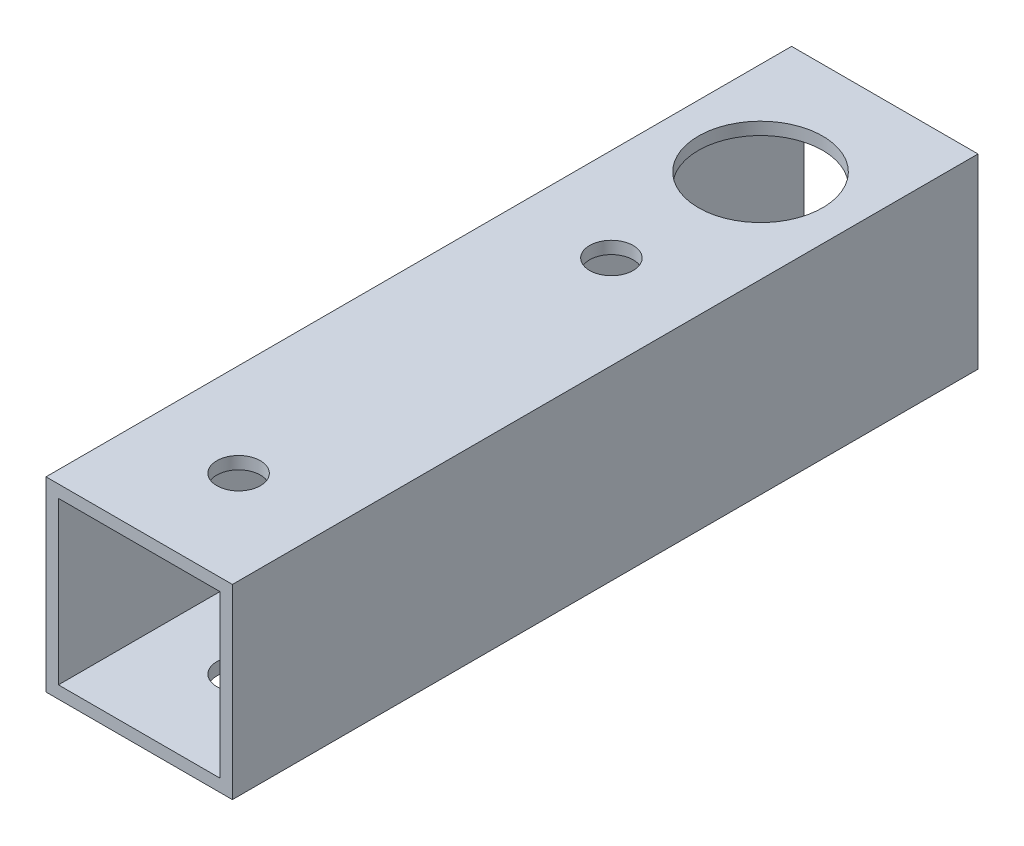
ISO-10303-21;
HEADER;
FILE_DESCRIPTION(('STEP AP214'),'2;1');
FILE_NAME('part.step','',(''),(''),'','','');
FILE_SCHEMA(('AUTOMOTIVE_DESIGN { 1 0 10303 214 1 1 1 1 }'));
ENDSEC;
DATA;
#1=APPLICATION_CONTEXT('core data for automotive mechanical design processes');
#2=APPLICATION_PROTOCOL_DEFINITION('international standard','automotive_design',2000,#1);
#3=PRODUCT_CONTEXT('',#1,'mechanical');
#4=PRODUCT('Part','Part','',(#3));
#5=PRODUCT_RELATED_PRODUCT_CATEGORY('part','',(#4));
#6=PRODUCT_DEFINITION_FORMATION('','',#4);
#7=PRODUCT_DEFINITION_CONTEXT('part definition',#1,'design');
#8=PRODUCT_DEFINITION('design','',#6,#7);
#9=PRODUCT_DEFINITION_SHAPE('','',#8);
#10=(LENGTH_UNIT() NAMED_UNIT(*) SI_UNIT(.MILLI.,.METRE.));
#11=(NAMED_UNIT(*) PLANE_ANGLE_UNIT() SI_UNIT($,.RADIAN.));
#12=(NAMED_UNIT(*) SI_UNIT($,.STERADIAN.) SOLID_ANGLE_UNIT());
#13=UNCERTAINTY_MEASURE_WITH_UNIT(LENGTH_MEASURE(1.E-05),#10,'distance_accuracy_value','');
#14=(GEOMETRIC_REPRESENTATION_CONTEXT(3) GLOBAL_UNCERTAINTY_ASSIGNED_CONTEXT((#13)) GLOBAL_UNIT_ASSIGNED_CONTEXT((#10,
#11,#12)) REPRESENTATION_CONTEXT('',''));
#15=CARTESIAN_POINT('',(0.,0.,0.));
#16=DIRECTION('',(0.,0.,1.));
#17=DIRECTION('',(1.,0.,0.));
#18=AXIS2_PLACEMENT_3D('',#15,#16,#17);
#19=CARTESIAN_POINT('',(-7.5,-7.50000000000001,30.));
#20=DIRECTION('',(0.,0.,1.));
#21=DIRECTION('',(1.,0.,0.));
#22=AXIS2_PLACEMENT_3D('',#19,#20,#21);
#23=PLANE('',#22);
#24=DIRECTION('',(0.,-1.,0.));
#25=VECTOR('',#24,1.);
#26=CARTESIAN_POINT('',(-7.5,-7.50000000000001,30.));
#27=LINE('',#26,#25);
#28=CARTESIAN_POINT('',(-7.5,7.49999999999999,30.));
#29=VERTEX_POINT('',#28);
#30=CARTESIAN_POINT('',(-7.5,-7.50000000000001,30.));
#31=VERTEX_POINT('',#30);
#32=EDGE_CURVE('E161',#29,#31,#27,.T.);
#33=ORIENTED_EDGE('',*,*,#32,.T.);
#34=DIRECTION('',(1.,0.,0.));
#35=VECTOR('',#34,1.);
#36=CARTESIAN_POINT('',(7.5,-7.50000000000001,30.));
#37=LINE('',#36,#35);
#38=CARTESIAN_POINT('',(7.5,-7.50000000000001,30.));
#39=VERTEX_POINT('',#38);
#40=EDGE_CURVE('E164',#31,#39,#37,.T.);
#41=ORIENTED_EDGE('',*,*,#40,.T.);
#42=DIRECTION('',(0.,1.,0.));
#43=VECTOR('',#42,1.);
#44=CARTESIAN_POINT('',(7.5,-7.50000000000001,30.));
#45=LINE('',#44,#43);
#46=CARTESIAN_POINT('',(7.5,7.49999999999999,30.));
#47=VERTEX_POINT('',#46);
#48=EDGE_CURVE('E167',#39,#47,#45,.T.);
#49=ORIENTED_EDGE('',*,*,#48,.T.);
#50=DIRECTION('',(-1.,0.,0.));
#51=VECTOR('',#50,1.);
#52=CARTESIAN_POINT('',(7.5,7.49999999999999,30.));
#53=LINE('',#52,#51);
#54=EDGE_CURVE('E169',#47,#29,#53,.T.);
#55=ORIENTED_EDGE('',*,*,#54,.T.);
#56=EDGE_LOOP('',(#33,#41,#49,#55));
#57=FACE_BOUND('',#56,.T.);
#58=DIRECTION('',(1.,0.,0.));
#59=VECTOR('',#58,1.);
#60=CARTESIAN_POINT('',(7.5,-6.50000000000001,30.));
#61=LINE('',#60,#59);
#62=CARTESIAN_POINT('',(-6.5,-6.50000000000001,30.));
#63=VERTEX_POINT('',#62);
#64=CARTESIAN_POINT('',(6.5,-6.50000000000001,30.));
#65=VERTEX_POINT('',#64);
#66=EDGE_CURVE('E131',#63,#65,#61,.T.);
#67=ORIENTED_EDGE('',*,*,#66,.F.);
#68=DIRECTION('',(0.,-1.,0.));
#69=VECTOR('',#68,1.);
#70=CARTESIAN_POINT('',(-6.5,-7.50000000000001,30.));
#71=LINE('',#70,#69);
#72=CARTESIAN_POINT('',(-6.5,6.49999999999999,30.));
#73=VERTEX_POINT('',#72);
#74=EDGE_CURVE('E123',#73,#63,#71,.T.);
#75=ORIENTED_EDGE('',*,*,#74,.F.);
#76=DIRECTION('',(-1.,0.,0.));
#77=VECTOR('',#76,1.);
#78=CARTESIAN_POINT('',(7.5,6.49999999999999,30.));
#79=LINE('',#78,#77);
#80=CARTESIAN_POINT('',(6.5,6.49999999999999,30.));
#81=VERTEX_POINT('',#80);
#82=EDGE_CURVE('E145',#81,#73,#79,.T.);
#83=ORIENTED_EDGE('',*,*,#82,.F.);
#84=DIRECTION('',(0.,1.,0.));
#85=VECTOR('',#84,1.);
#86=CARTESIAN_POINT('',(6.5,-7.50000000000001,30.));
#87=LINE('',#86,#85);
#88=EDGE_CURVE('E143',#65,#81,#87,.T.);
#89=ORIENTED_EDGE('',*,*,#88,.F.);
#90=EDGE_LOOP('',(#67,#75,#83,#89));
#91=FACE_BOUND('',#90,.T.);
#92=ADVANCED_FACE('F56',(#57,#91),#23,.T.);
#93=CARTESIAN_POINT('',(-7.5,-7.50000000000001,-30.));
#94=DIRECTION('',(0.,0.,1.));
#95=DIRECTION('',(1.,0.,0.));
#96=AXIS2_PLACEMENT_3D('',#93,#94,#95);
#97=PLANE('',#96);
#98=DIRECTION('',(0.,-1.,0.));
#99=VECTOR('',#98,1.);
#100=CARTESIAN_POINT('',(-7.5,-7.50000000000001,-30.));
#101=LINE('',#100,#99);
#102=CARTESIAN_POINT('',(-7.5,7.49999999999999,-30.));
#103=VERTEX_POINT('',#102);
#104=CARTESIAN_POINT('',(-7.5,-7.50000000000001,-30.));
#105=VERTEX_POINT('',#104);
#106=EDGE_CURVE('E139',#103,#105,#101,.T.);
#107=ORIENTED_EDGE('',*,*,#106,.F.);
#108=DIRECTION('',(-1.,0.,0.));
#109=VECTOR('',#108,1.);
#110=CARTESIAN_POINT('',(7.5,7.49999999999999,-30.));
#111=LINE('',#110,#109);
#112=CARTESIAN_POINT('',(7.5,7.49999999999999,-30.));
#113=VERTEX_POINT('',#112);
#114=EDGE_CURVE('E165',#113,#103,#111,.T.);
#115=ORIENTED_EDGE('',*,*,#114,.F.);
#116=DIRECTION('',(0.,1.,0.));
#117=VECTOR('',#116,1.);
#118=CARTESIAN_POINT('',(7.5,-7.50000000000001,-30.));
#119=LINE('',#118,#117);
#120=CARTESIAN_POINT('',(7.5,-7.50000000000001,-30.));
#121=VERTEX_POINT('',#120);
#122=EDGE_CURVE('E176',#121,#113,#119,.T.);
#123=ORIENTED_EDGE('',*,*,#122,.F.);
#124=DIRECTION('',(1.,0.,0.));
#125=VECTOR('',#124,1.);
#126=CARTESIAN_POINT('',(7.5,-7.50000000000001,-30.));
#127=LINE('',#126,#125);
#128=EDGE_CURVE('E174',#105,#121,#127,.T.);
#129=ORIENTED_EDGE('',*,*,#128,.F.);
#130=EDGE_LOOP('',(#107,#115,#123,#129));
#131=FACE_BOUND('',#130,.T.);
#132=DIRECTION('',(0.,-1.,0.));
#133=VECTOR('',#132,1.);
#134=CARTESIAN_POINT('',(-6.5,-7.50000000000001,-30.));
#135=LINE('',#134,#133);
#136=CARTESIAN_POINT('',(-6.5,6.49999999999999,-30.));
#137=VERTEX_POINT('',#136);
#138=CARTESIAN_POINT('',(-6.5,-6.50000000000001,-30.));
#139=VERTEX_POINT('',#138);
#140=EDGE_CURVE('E81',#137,#139,#135,.T.);
#141=ORIENTED_EDGE('',*,*,#140,.T.);
#142=DIRECTION('',(1.,0.,0.));
#143=VECTOR('',#142,1.);
#144=CARTESIAN_POINT('',(7.5,-6.50000000000001,-30.));
#145=LINE('',#144,#143);
#146=CARTESIAN_POINT('',(6.5,-6.50000000000001,-30.));
#147=VERTEX_POINT('',#146);
#148=EDGE_CURVE('E138',#139,#147,#145,.T.);
#149=ORIENTED_EDGE('',*,*,#148,.T.);
#150=DIRECTION('',(0.,1.,0.));
#151=VECTOR('',#150,1.);
#152=CARTESIAN_POINT('',(6.5,-7.50000000000001,-30.));
#153=LINE('',#152,#151);
#154=CARTESIAN_POINT('',(6.5,6.49999999999999,-30.));
#155=VERTEX_POINT('',#154);
#156=EDGE_CURVE('E153',#147,#155,#153,.T.);
#157=ORIENTED_EDGE('',*,*,#156,.T.);
#158=DIRECTION('',(-1.,0.,0.));
#159=VECTOR('',#158,1.);
#160=CARTESIAN_POINT('',(7.5,6.49999999999999,-30.));
#161=LINE('',#160,#159);
#162=EDGE_CURVE('E132',#155,#137,#161,.T.);
#163=ORIENTED_EDGE('',*,*,#162,.T.);
#164=EDGE_LOOP('',(#141,#149,#157,#163));
#165=FACE_BOUND('',#164,.T.);
#166=ADVANCED_FACE('F236',(#131,#165),#97,.F.);
#167=CARTESIAN_POINT('',(-7.5,-7.50000000000001,30.));
#168=DIRECTION('',(1.,0.,0.));
#169=DIRECTION('',(0.,0.,-1.));
#170=AXIS2_PLACEMENT_3D('',#167,#168,#169);
#171=PLANE('',#170);
#172=ORIENTED_EDGE('',*,*,#106,.T.);
#173=DIRECTION('',(0.,0.,-1.));
#174=VECTOR('',#173,1.);
#175=CARTESIAN_POINT('',(-7.5,-7.50000000000001,30.));
#176=LINE('',#175,#174);
#177=EDGE_CURVE('E12',#31,#105,#176,.T.);
#178=ORIENTED_EDGE('',*,*,#177,.F.);
#179=ORIENTED_EDGE('',*,*,#32,.F.);
#180=DIRECTION('',(0.,0.,-1.));
#181=VECTOR('',#180,1.);
#182=CARTESIAN_POINT('',(-7.5,7.49999999999999,30.));
#183=LINE('',#182,#181);
#184=EDGE_CURVE('E171',#29,#103,#183,.T.);
#185=ORIENTED_EDGE('',*,*,#184,.T.);
#186=EDGE_LOOP('',(#172,#178,#179,#185));
#187=FACE_BOUND('',#186,.T.);
#188=ADVANCED_FACE('F58',(#187),#171,.F.);
#189=CARTESIAN_POINT('',(7.5,-7.50000000000001,30.));
#190=DIRECTION('',(0.,1.,0.));
#191=DIRECTION('',(0.,0.,1.));
#192=AXIS2_PLACEMENT_3D('',#189,#190,#191);
#193=PLANE('',#192);
#194=CARTESIAN_POINT('',(0.,-7.50000000000001,-20.));
#195=DIRECTION('',(0.,1.,0.));
#196=DIRECTION('',(0.,0.,1.));
#197=AXIS2_PLACEMENT_3D('',#194,#195,#196);
#198=CIRCLE('',#197,5.);
#199=CARTESIAN_POINT('',(0.,-7.50000000000001,-15.));
#200=VERTEX_POINT('',#199);
#201=EDGE_CURVE('E200',#200,#200,#198,.T.);
#202=ORIENTED_EDGE('',*,*,#201,.T.);
#203=EDGE_LOOP('',(#202));
#204=FACE_BOUND('',#203,.T.);
#205=CARTESIAN_POINT('',(0.,-7.50000000000001,-8.));
#206=DIRECTION('',(0.,1.,0.));
#207=DIRECTION('',(0.,0.,1.));
#208=AXIS2_PLACEMENT_3D('',#205,#206,#207);
#209=CIRCLE('',#208,1.75);
#210=CARTESIAN_POINT('',(0.,-7.50000000000001,-6.25));
#211=VERTEX_POINT('',#210);
#212=EDGE_CURVE('E197',#211,#211,#209,.T.);
#213=ORIENTED_EDGE('',*,*,#212,.T.);
#214=EDGE_LOOP('',(#213));
#215=FACE_BOUND('',#214,.T.);
#216=CARTESIAN_POINT('',(0.,-7.50000000000001,22.));
#217=DIRECTION('',(0.,1.,0.));
#218=DIRECTION('',(0.,0.,1.));
#219=AXIS2_PLACEMENT_3D('',#216,#217,#218);
#220=CIRCLE('',#219,1.75);
#221=CARTESIAN_POINT('',(0.,-7.50000000000001,23.75));
#222=VERTEX_POINT('',#221);
#223=EDGE_CURVE('E151',#222,#222,#220,.T.);
#224=ORIENTED_EDGE('',*,*,#223,.T.);
#225=EDGE_LOOP('',(#224));
#226=FACE_BOUND('',#225,.T.);
#227=ORIENTED_EDGE('',*,*,#128,.T.);
#228=DIRECTION('',(0.,0.,-1.));
#229=VECTOR('',#228,1.);
#230=CARTESIAN_POINT('',(7.5,-7.50000000000001,30.));
#231=LINE('',#230,#229);
#232=EDGE_CURVE('E65',#39,#121,#231,.T.);
#233=ORIENTED_EDGE('',*,*,#232,.F.);
#234=ORIENTED_EDGE('',*,*,#40,.F.);
#235=ORIENTED_EDGE('',*,*,#177,.T.);
#236=EDGE_LOOP('',(#227,#233,#234,#235));
#237=FACE_BOUND('',#236,.T.);
#238=ADVANCED_FACE('F217',(#204,#215,#226,#237),#193,.F.);
#239=CARTESIAN_POINT('',(7.5,-7.50000000000001,30.));
#240=DIRECTION('',(-1.,0.,0.));
#241=DIRECTION('',(0.,0.,1.));
#242=AXIS2_PLACEMENT_3D('',#239,#240,#241);
#243=PLANE('',#242);
#244=ORIENTED_EDGE('',*,*,#122,.T.);
#245=DIRECTION('',(0.,0.,-1.));
#246=VECTOR('',#245,1.);
#247=CARTESIAN_POINT('',(7.5,7.49999999999999,30.));
#248=LINE('',#247,#246);
#249=EDGE_CURVE('E181',#47,#113,#248,.T.);
#250=ORIENTED_EDGE('',*,*,#249,.F.);
#251=ORIENTED_EDGE('',*,*,#48,.F.);
#252=ORIENTED_EDGE('',*,*,#232,.T.);
#253=EDGE_LOOP('',(#244,#250,#251,#252));
#254=FACE_BOUND('',#253,.T.);
#255=ADVANCED_FACE('F250',(#254),#243,.F.);
#256=CARTESIAN_POINT('',(7.5,7.49999999999999,30.));
#257=DIRECTION('',(0.,-1.,0.));
#258=DIRECTION('',(0.,0.,-1.));
#259=AXIS2_PLACEMENT_3D('',#256,#257,#258);
#260=PLANE('',#259);
#261=CARTESIAN_POINT('',(0.,7.49999999999999,-20.));
#262=DIRECTION('',(0.,1.,0.));
#263=DIRECTION('',(0.,0.,1.));
#264=AXIS2_PLACEMENT_3D('',#261,#262,#263);
#265=CIRCLE('',#264,5.);
#266=CARTESIAN_POINT('',(0.,7.49999999999999,-15.));
#267=VERTEX_POINT('',#266);
#268=EDGE_CURVE('E312',#267,#267,#265,.T.);
#269=ORIENTED_EDGE('',*,*,#268,.F.);
#270=EDGE_LOOP('',(#269));
#271=FACE_BOUND('',#270,.T.);
#272=CARTESIAN_POINT('',(0.,7.49999999999999,-8.));
#273=DIRECTION('',(0.,1.,0.));
#274=DIRECTION('',(0.,0.,1.));
#275=AXIS2_PLACEMENT_3D('',#272,#273,#274);
#276=CIRCLE('',#275,1.75);
#277=CARTESIAN_POINT('',(0.,7.49999999999999,-6.25));
#278=VERTEX_POINT('',#277);
#279=EDGE_CURVE('E193',#278,#278,#276,.T.);
#280=ORIENTED_EDGE('',*,*,#279,.F.);
#281=EDGE_LOOP('',(#280));
#282=FACE_BOUND('',#281,.T.);
#283=CARTESIAN_POINT('',(0.,7.49999999999999,22.));
#284=DIRECTION('',(0.,1.,0.));
#285=DIRECTION('',(0.,0.,1.));
#286=AXIS2_PLACEMENT_3D('',#283,#284,#285);
#287=CIRCLE('',#286,1.75);
#288=CARTESIAN_POINT('',(0.,7.49999999999999,23.75));
#289=VERTEX_POINT('',#288);
#290=EDGE_CURVE('E189',#289,#289,#287,.T.);
#291=ORIENTED_EDGE('',*,*,#290,.F.);
#292=EDGE_LOOP('',(#291));
#293=FACE_BOUND('',#292,.T.);
#294=ORIENTED_EDGE('',*,*,#114,.T.);
#295=ORIENTED_EDGE('',*,*,#184,.F.);
#296=ORIENTED_EDGE('',*,*,#54,.F.);
#297=ORIENTED_EDGE('',*,*,#249,.T.);
#298=EDGE_LOOP('',(#294,#295,#296,#297));
#299=FACE_BOUND('',#298,.T.);
#300=ADVANCED_FACE('F247',(#271,#282,#293,#299),#260,.F.);
#301=CARTESIAN_POINT('',(-6.5,-7.50000000000001,30.));
#302=DIRECTION('',(1.,0.,0.));
#303=DIRECTION('',(0.,0.,-1.));
#304=AXIS2_PLACEMENT_3D('',#301,#302,#303);
#305=PLANE('',#304);
#306=ORIENTED_EDGE('',*,*,#140,.F.);
#307=DIRECTION('',(0.,0.,-1.));
#308=VECTOR('',#307,1.);
#309=CARTESIAN_POINT('',(-6.5,6.49999999999999,30.));
#310=LINE('',#309,#308);
#311=EDGE_CURVE('E127',#73,#137,#310,.T.);
#312=ORIENTED_EDGE('',*,*,#311,.F.);
#313=ORIENTED_EDGE('',*,*,#74,.T.);
#314=DIRECTION('',(0.,0.,-1.));
#315=VECTOR('',#314,1.);
#316=CARTESIAN_POINT('',(-6.5,-6.50000000000001,30.));
#317=LINE('',#316,#315);
#318=EDGE_CURVE('E126',#63,#139,#317,.T.);
#319=ORIENTED_EDGE('',*,*,#318,.T.);
#320=EDGE_LOOP('',(#306,#312,#313,#319));
#321=FACE_BOUND('',#320,.T.);
#322=ADVANCED_FACE('F125',(#321),#305,.T.);
#323=CARTESIAN_POINT('',(7.5,-6.50000000000001,30.));
#324=DIRECTION('',(0.,1.,0.));
#325=DIRECTION('',(0.,0.,1.));
#326=AXIS2_PLACEMENT_3D('',#323,#324,#325);
#327=PLANE('',#326);
#328=CARTESIAN_POINT('',(0.,-6.50000000000001,-20.));
#329=DIRECTION('',(0.,1.,0.));
#330=DIRECTION('',(0.,0.,1.));
#331=AXIS2_PLACEMENT_3D('',#328,#329,#330);
#332=CIRCLE('',#331,5.);
#333=CARTESIAN_POINT('',(0.,-6.50000000000001,-15.));
#334=VERTEX_POINT('',#333);
#335=EDGE_CURVE('E205',#334,#334,#332,.T.);
#336=ORIENTED_EDGE('',*,*,#335,.F.);
#337=EDGE_LOOP('',(#336));
#338=FACE_BOUND('',#337,.T.);
#339=CARTESIAN_POINT('',(0.,-6.50000000000001,-8.));
#340=DIRECTION('',(0.,1.,0.));
#341=DIRECTION('',(0.,0.,1.));
#342=AXIS2_PLACEMENT_3D('',#339,#340,#341);
#343=CIRCLE('',#342,1.75);
#344=CARTESIAN_POINT('',(0.,-6.50000000000001,-6.25));
#345=VERTEX_POINT('',#344);
#346=EDGE_CURVE('E192',#345,#345,#343,.T.);
#347=ORIENTED_EDGE('',*,*,#346,.F.);
#348=EDGE_LOOP('',(#347));
#349=FACE_BOUND('',#348,.T.);
#350=CARTESIAN_POINT('',(0.,-6.50000000000001,22.));
#351=DIRECTION('',(0.,1.,0.));
#352=DIRECTION('',(0.,0.,1.));
#353=AXIS2_PLACEMENT_3D('',#350,#351,#352);
#354=CIRCLE('',#353,1.75);
#355=CARTESIAN_POINT('',(0.,-6.50000000000001,23.75));
#356=VERTEX_POINT('',#355);
#357=EDGE_CURVE('E188',#356,#356,#354,.T.);
#358=ORIENTED_EDGE('',*,*,#357,.F.);
#359=EDGE_LOOP('',(#358));
#360=FACE_BOUND('',#359,.T.);
#361=ORIENTED_EDGE('',*,*,#148,.F.);
#362=ORIENTED_EDGE('',*,*,#318,.F.);
#363=ORIENTED_EDGE('',*,*,#66,.T.);
#364=DIRECTION('',(0.,0.,-1.));
#365=VECTOR('',#364,1.);
#366=CARTESIAN_POINT('',(6.5,-6.50000000000001,30.));
#367=LINE('',#366,#365);
#368=EDGE_CURVE('E140',#65,#147,#367,.T.);
#369=ORIENTED_EDGE('',*,*,#368,.T.);
#370=EDGE_LOOP('',(#361,#362,#363,#369));
#371=FACE_BOUND('',#370,.T.);
#372=ADVANCED_FACE('F135',(#338,#349,#360,#371),#327,.T.);
#373=CARTESIAN_POINT('',(6.5,-7.50000000000001,30.));
#374=DIRECTION('',(-1.,0.,0.));
#375=DIRECTION('',(0.,0.,1.));
#376=AXIS2_PLACEMENT_3D('',#373,#374,#375);
#377=PLANE('',#376);
#378=ORIENTED_EDGE('',*,*,#156,.F.);
#379=ORIENTED_EDGE('',*,*,#368,.F.);
#380=ORIENTED_EDGE('',*,*,#88,.T.);
#381=DIRECTION('',(0.,0.,-1.));
#382=VECTOR('',#381,1.);
#383=CARTESIAN_POINT('',(6.5,6.49999999999999,30.));
#384=LINE('',#383,#382);
#385=EDGE_CURVE('E73',#81,#155,#384,.T.);
#386=ORIENTED_EDGE('',*,*,#385,.T.);
#387=EDGE_LOOP('',(#378,#379,#380,#386));
#388=FACE_BOUND('',#387,.T.);
#389=ADVANCED_FACE('F277',(#388),#377,.T.);
#390=CARTESIAN_POINT('',(7.5,6.49999999999999,30.));
#391=DIRECTION('',(0.,-1.,0.));
#392=DIRECTION('',(0.,0.,-1.));
#393=AXIS2_PLACEMENT_3D('',#390,#391,#392);
#394=PLANE('',#393);
#395=CARTESIAN_POINT('',(0.,6.49999999999999,-20.));
#396=DIRECTION('',(0.,-1.,0.));
#397=DIRECTION('',(0.,0.,-1.));
#398=AXIS2_PLACEMENT_3D('',#395,#396,#397);
#399=CIRCLE('',#398,5.);
#400=CARTESIAN_POINT('',(0.,6.49999999999999,-25.));
#401=VERTEX_POINT('',#400);
#402=EDGE_CURVE('E60',#401,#401,#399,.T.);
#403=ORIENTED_EDGE('',*,*,#402,.F.);
#404=EDGE_LOOP('',(#403));
#405=FACE_BOUND('',#404,.T.);
#406=CARTESIAN_POINT('',(0.,6.49999999999999,-8.));
#407=DIRECTION('',(0.,-1.,0.));
#408=DIRECTION('',(0.,0.,-1.));
#409=AXIS2_PLACEMENT_3D('',#406,#407,#408);
#410=CIRCLE('',#409,1.75);
#411=CARTESIAN_POINT('',(0.,6.49999999999999,-9.75));
#412=VERTEX_POINT('',#411);
#413=EDGE_CURVE('E190',#412,#412,#410,.T.);
#414=ORIENTED_EDGE('',*,*,#413,.F.);
#415=EDGE_LOOP('',(#414));
#416=FACE_BOUND('',#415,.T.);
#417=CARTESIAN_POINT('',(0.,6.49999999999999,22.));
#418=DIRECTION('',(0.,-1.,0.));
#419=DIRECTION('',(0.,0.,-1.));
#420=AXIS2_PLACEMENT_3D('',#417,#418,#419);
#421=CIRCLE('',#420,1.75);
#422=CARTESIAN_POINT('',(0.,6.49999999999999,20.25));
#423=VERTEX_POINT('',#422);
#424=EDGE_CURVE('E186',#423,#423,#421,.T.);
#425=ORIENTED_EDGE('',*,*,#424,.F.);
#426=EDGE_LOOP('',(#425));
#427=FACE_BOUND('',#426,.T.);
#428=ORIENTED_EDGE('',*,*,#162,.F.);
#429=ORIENTED_EDGE('',*,*,#385,.F.);
#430=ORIENTED_EDGE('',*,*,#82,.T.);
#431=ORIENTED_EDGE('',*,*,#311,.T.);
#432=EDGE_LOOP('',(#428,#429,#430,#431));
#433=FACE_BOUND('',#432,.T.);
#434=ADVANCED_FACE('F232',(#405,#416,#427,#433),#394,.T.);
#435=CARTESIAN_POINT('',(0.,-9.50000000000001,22.));
#436=DIRECTION('',(0.,1.,0.));
#437=DIRECTION('',(0.,0.,1.));
#438=AXIS2_PLACEMENT_3D('',#435,#436,#437);
#439=CYLINDRICAL_SURFACE('',#438,1.75);
#440=ORIENTED_EDGE('',*,*,#424,.T.);
#441=EDGE_LOOP('',(#440));
#442=FACE_BOUND('',#441,.T.);
#443=ORIENTED_EDGE('',*,*,#290,.T.);
#444=EDGE_LOOP('',(#443));
#445=FACE_BOUND('',#444,.T.);
#446=ADVANCED_FACE('F223',(#442,#445),#439,.F.);
#447=ORIENTED_EDGE('',*,*,#357,.T.);
#448=EDGE_LOOP('',(#447));
#449=FACE_BOUND('',#448,.T.);
#450=ORIENTED_EDGE('',*,*,#223,.F.);
#451=EDGE_LOOP('',(#450));
#452=FACE_BOUND('',#451,.T.);
#453=ADVANCED_FACE('F220',(#449,#452),#439,.F.);
#454=CARTESIAN_POINT('',(0.,-9.50000000000001,-8.));
#455=DIRECTION('',(0.,1.,0.));
#456=DIRECTION('',(0.,0.,1.));
#457=AXIS2_PLACEMENT_3D('',#454,#455,#456);
#458=CYLINDRICAL_SURFACE('',#457,1.75);
#459=ORIENTED_EDGE('',*,*,#413,.T.);
#460=EDGE_LOOP('',(#459));
#461=FACE_BOUND('',#460,.T.);
#462=ORIENTED_EDGE('',*,*,#279,.T.);
#463=EDGE_LOOP('',(#462));
#464=FACE_BOUND('',#463,.T.);
#465=ADVANCED_FACE('F222',(#461,#464),#458,.F.);
#466=ORIENTED_EDGE('',*,*,#346,.T.);
#467=EDGE_LOOP('',(#466));
#468=FACE_BOUND('',#467,.T.);
#469=ORIENTED_EDGE('',*,*,#212,.F.);
#470=EDGE_LOOP('',(#469));
#471=FACE_BOUND('',#470,.T.);
#472=ADVANCED_FACE('F230',(#468,#471),#458,.F.);
#473=CARTESIAN_POINT('',(0.,-9.50000000000001,-20.));
#474=DIRECTION('',(0.,1.,0.));
#475=DIRECTION('',(0.,0.,1.));
#476=AXIS2_PLACEMENT_3D('',#473,#474,#475);
#477=CYLINDRICAL_SURFACE('',#476,5.);
#478=ORIENTED_EDGE('',*,*,#402,.T.);
#479=EDGE_LOOP('',(#478));
#480=FACE_BOUND('',#479,.T.);
#481=ORIENTED_EDGE('',*,*,#268,.T.);
#482=EDGE_LOOP('',(#481));
#483=FACE_BOUND('',#482,.T.);
#484=ADVANCED_FACE('F265',(#480,#483),#477,.F.);
#485=ORIENTED_EDGE('',*,*,#335,.T.);
#486=EDGE_LOOP('',(#485));
#487=FACE_BOUND('',#486,.T.);
#488=ORIENTED_EDGE('',*,*,#201,.F.);
#489=EDGE_LOOP('',(#488));
#490=FACE_BOUND('',#489,.T.);
#491=ADVANCED_FACE('F270',(#487,#490),#477,.F.);
#492=CLOSED_SHELL('',(#92,#166,#188,#238,#255,#300,#322,#372,#389,#434,#446,#453,#465,#472,#484,#491));
#493=MANIFOLD_SOLID_BREP('B2',#492);
#494=ADVANCED_BREP_SHAPE_REPRESENTATION('',(#18,#493),#14);
#495=SHAPE_DEFINITION_REPRESENTATION(#9,#494);
ENDSEC;
END-ISO-10303-21;
